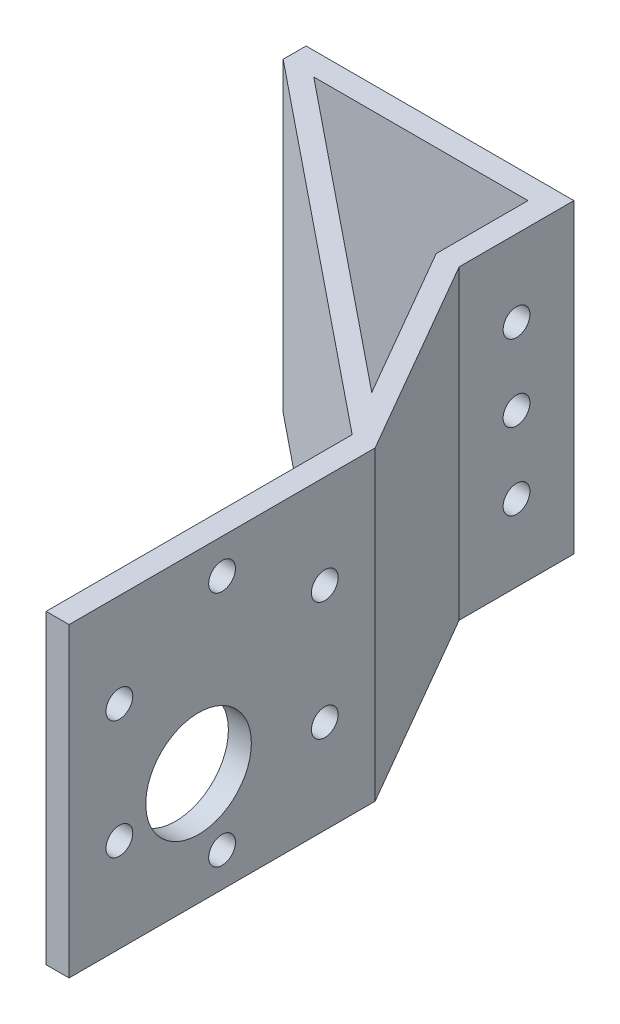
ISO-10303-21;
HEADER;
FILE_DESCRIPTION(('STEP AP214'),'2;1');
FILE_NAME('part.step','',(''),(''),'','','');
FILE_SCHEMA(('AUTOMOTIVE_DESIGN { 1 0 10303 214 1 1 1 1 }'));
ENDSEC;
DATA;
#1=APPLICATION_CONTEXT('core data for automotive mechanical design processes');
#2=APPLICATION_PROTOCOL_DEFINITION('international standard','automotive_design',2000,#1);
#3=PRODUCT_CONTEXT('',#1,'mechanical');
#4=PRODUCT('Part','Part','',(#3));
#5=PRODUCT_RELATED_PRODUCT_CATEGORY('part','',(#4));
#6=PRODUCT_DEFINITION_FORMATION('','',#4);
#7=PRODUCT_DEFINITION_CONTEXT('part definition',#1,'design');
#8=PRODUCT_DEFINITION('design','',#6,#7);
#9=PRODUCT_DEFINITION_SHAPE('','',#8);
#10=(LENGTH_UNIT() NAMED_UNIT(*) SI_UNIT(.MILLI.,.METRE.));
#11=(NAMED_UNIT(*) PLANE_ANGLE_UNIT() SI_UNIT($,.RADIAN.));
#12=(NAMED_UNIT(*) SI_UNIT($,.STERADIAN.) SOLID_ANGLE_UNIT());
#13=UNCERTAINTY_MEASURE_WITH_UNIT(LENGTH_MEASURE(1.E-05),#10,'distance_accuracy_value','');
#14=(GEOMETRIC_REPRESENTATION_CONTEXT(3) GLOBAL_UNCERTAINTY_ASSIGNED_CONTEXT((#13)) GLOBAL_UNIT_ASSIGNED_CONTEXT((#10,
#11,#12)) REPRESENTATION_CONTEXT('',''));
#15=CARTESIAN_POINT('',(0.,0.,0.));
#16=DIRECTION('',(0.,0.,1.));
#17=DIRECTION('',(1.,0.,0.));
#18=AXIS2_PLACEMENT_3D('',#15,#16,#17);
#19=CARTESIAN_POINT('',(0.,40.,0.));
#20=DIRECTION('',(0.,1.,0.));
#21=DIRECTION('',(0.,0.,1.));
#22=AXIS2_PLACEMENT_3D('',#19,#20,#21);
#23=PLANE('',#22);
#24=DIRECTION('',(0.,0.,-1.));
#25=VECTOR('',#24,1.);
#26=CARTESIAN_POINT('',(0.,40.,0.));
#27=LINE('',#26,#25);
#28=CARTESIAN_POINT('',(0.,40.,15.));
#29=VERTEX_POINT('',#28);
#30=CARTESIAN_POINT('',(0.,40.,0.));
#31=VERTEX_POINT('',#30);
#32=EDGE_CURVE('E164',#29,#31,#27,.T.);
#33=ORIENTED_EDGE('',*,*,#32,.T.);
#34=DIRECTION('',(-1.,0.,0.));
#35=VECTOR('',#34,1.);
#36=CARTESIAN_POINT('',(0.,40.,0.));
#37=LINE('',#36,#35);
#38=CARTESIAN_POINT('',(-35.,40.,0.));
#39=VERTEX_POINT('',#38);
#40=EDGE_CURVE('E167',#31,#39,#37,.T.);
#41=ORIENTED_EDGE('',*,*,#40,.T.);
#42=DIRECTION('',(-1.41090842712752E-13,0.,1.));
#43=VECTOR('',#42,1.);
#44=CARTESIAN_POINT('',(-35.,40.,0.));
#45=LINE('',#44,#43);
#46=CARTESIAN_POINT('',(-35.0000000000004,40.,3.0000000000006));
#47=VERTEX_POINT('',#46);
#48=EDGE_CURVE('E170',#39,#47,#45,.T.);
#49=ORIENTED_EDGE('',*,*,#48,.T.);
#50=DIRECTION('',(0.777785653858588,0.,0.628529614777035));
#51=VECTOR('',#50,1.);
#52=CARTESIAN_POINT('',(-35.0000000000004,40.,3.0000000000006));
#53=LINE('',#52,#51);
#54=CARTESIAN_POINT('',(12.0000000000003,40.,40.9807621135328));
#55=VERTEX_POINT('',#54);
#56=EDGE_CURVE('E172',#47,#55,#53,.T.);
#57=ORIENTED_EDGE('',*,*,#56,.T.);
#58=DIRECTION('',(0.,0.,1.));
#59=VECTOR('',#58,1.);
#60=CARTESIAN_POINT('',(12.0000000000003,40.,40.9807621135328));
#61=LINE('',#60,#59);
#62=CARTESIAN_POINT('',(12.,40.,80.9807621135331));
#63=VERTEX_POINT('',#62);
#64=EDGE_CURVE('E174',#55,#63,#61,.T.);
#65=ORIENTED_EDGE('',*,*,#64,.T.);
#66=DIRECTION('',(1.,0.,0.));
#67=VECTOR('',#66,1.);
#68=CARTESIAN_POINT('',(12.,40.,80.9807621135331));
#69=LINE('',#68,#67);
#70=CARTESIAN_POINT('',(15.,40.,80.9807621135331));
#71=VERTEX_POINT('',#70);
#72=EDGE_CURVE('E176',#63,#71,#69,.T.);
#73=ORIENTED_EDGE('',*,*,#72,.T.);
#74=DIRECTION('',(0.,0.,-1.));
#75=VECTOR('',#74,1.);
#76=CARTESIAN_POINT('',(15.,40.,40.9807621135331));
#77=LINE('',#76,#75);
#78=CARTESIAN_POINT('',(15.,40.,40.9807621135331));
#79=VERTEX_POINT('',#78);
#80=EDGE_CURVE('E178',#71,#79,#77,.T.);
#81=ORIENTED_EDGE('',*,*,#80,.T.);
#82=DIRECTION('',(-0.500000000000001,0.,-0.866025403784438));
#83=VECTOR('',#82,1.);
#84=CARTESIAN_POINT('',(0.,40.,15.));
#85=LINE('',#84,#83);
#86=EDGE_CURVE('E180',#79,#29,#85,.T.);
#87=ORIENTED_EDGE('',*,*,#86,.T.);
#88=EDGE_LOOP('',(#33,#41,#49,#57,#65,#73,#81,#87));
#89=FACE_BOUND('',#88,.T.);
#90=DIRECTION('',(0.777785653858585,0.,0.628529614777039));
#91=VECTOR('',#90,1.);
#92=CARTESIAN_POINT('',(-31.0000000000005,40.,3.00000000000068));
#93=LINE('',#92,#91);
#94=CARTESIAN_POINT('',(-31.0000000000005,40.,3.00000000000068));
#95=VERTEX_POINT('',#94);
#96=CARTESIAN_POINT('',(8.50153462367659,40.,34.9212423332204));
#97=VERTEX_POINT('',#96);
#98=EDGE_CURVE('E134',#95,#97,#93,.T.);
#99=ORIENTED_EDGE('',*,*,#98,.F.);
#100=DIRECTION('',(-1.,0.,0.));
#101=VECTOR('',#100,1.);
#102=CARTESIAN_POINT('',(-3.,40.,3.));
#103=LINE('',#102,#101);
#104=CARTESIAN_POINT('',(-3.,40.,3.));
#105=VERTEX_POINT('',#104);
#106=EDGE_CURVE('E126',#105,#95,#103,.T.);
#107=ORIENTED_EDGE('',*,*,#106,.F.);
#108=DIRECTION('',(0.,0.,-1.));
#109=VECTOR('',#108,1.);
#110=CARTESIAN_POINT('',(-2.99999999999996,40.,15.));
#111=LINE('',#110,#109);
#112=CARTESIAN_POINT('',(-2.99999999999996,40.,15.));
#113=VERTEX_POINT('',#112);
#114=EDGE_CURVE('E148',#113,#105,#111,.T.);
#115=ORIENTED_EDGE('',*,*,#114,.F.);
#116=DIRECTION('',(-0.500000000000001,0.,-0.866025403784438));
#117=VECTOR('',#116,1.);
#118=CARTESIAN_POINT('',(-2.99999999999996,40.,15.));
#119=LINE('',#118,#117);
#120=EDGE_CURVE('E146',#97,#113,#119,.T.);
#121=ORIENTED_EDGE('',*,*,#120,.F.);
#122=EDGE_LOOP('',(#99,#107,#115,#121));
#123=FACE_BOUND('',#122,.T.);
#124=ADVANCED_FACE('F37',(#89,#123),#23,.T.);
#125=CARTESIAN_POINT('',(0.,0.,0.));
#126=DIRECTION('',(0.,1.,0.));
#127=DIRECTION('',(0.,0.,1.));
#128=AXIS2_PLACEMENT_3D('',#125,#126,#127);
#129=PLANE('',#128);
#130=DIRECTION('',(0.,0.,-1.));
#131=VECTOR('',#130,1.);
#132=CARTESIAN_POINT('',(0.,0.,0.));
#133=LINE('',#132,#131);
#134=CARTESIAN_POINT('',(0.,0.,15.));
#135=VERTEX_POINT('',#134);
#136=CARTESIAN_POINT('',(0.,0.,0.));
#137=VERTEX_POINT('',#136);
#138=EDGE_CURVE('E142',#135,#137,#133,.T.);
#139=ORIENTED_EDGE('',*,*,#138,.F.);
#140=DIRECTION('',(-0.500000000000001,0.,-0.866025403784438));
#141=VECTOR('',#140,1.);
#142=CARTESIAN_POINT('',(0.,0.,15.));
#143=LINE('',#142,#141);
#144=CARTESIAN_POINT('',(15.,0.,40.9807621135331));
#145=VERTEX_POINT('',#144);
#146=EDGE_CURVE('E168',#145,#135,#143,.T.);
#147=ORIENTED_EDGE('',*,*,#146,.F.);
#148=DIRECTION('',(0.,0.,-1.));
#149=VECTOR('',#148,1.);
#150=CARTESIAN_POINT('',(15.,0.,40.9807621135331));
#151=LINE('',#150,#149);
#152=CARTESIAN_POINT('',(15.,0.,80.9807621135331));
#153=VERTEX_POINT('',#152);
#154=EDGE_CURVE('E195',#153,#145,#151,.T.);
#155=ORIENTED_EDGE('',*,*,#154,.F.);
#156=DIRECTION('',(1.,0.,0.));
#157=VECTOR('',#156,1.);
#158=CARTESIAN_POINT('',(12.,0.,80.9807621135331));
#159=LINE('',#158,#157);
#160=CARTESIAN_POINT('',(12.,0.,80.9807621135331));
#161=VERTEX_POINT('',#160);
#162=EDGE_CURVE('E193',#161,#153,#159,.T.);
#163=ORIENTED_EDGE('',*,*,#162,.F.);
#164=DIRECTION('',(0.,0.,1.));
#165=VECTOR('',#164,1.);
#166=CARTESIAN_POINT('',(12.0000000000003,0.,40.9807621135328));
#167=LINE('',#166,#165);
#168=CARTESIAN_POINT('',(12.0000000000003,0.,40.9807621135328));
#169=VERTEX_POINT('',#168);
#170=EDGE_CURVE('E191',#169,#161,#167,.T.);
#171=ORIENTED_EDGE('',*,*,#170,.F.);
#172=DIRECTION('',(0.777785653858588,0.,0.628529614777035));
#173=VECTOR('',#172,1.);
#174=CARTESIAN_POINT('',(-35.0000000000004,0.,3.0000000000006));
#175=LINE('',#174,#173);
#176=CARTESIAN_POINT('',(-35.0000000000004,0.,3.0000000000006));
#177=VERTEX_POINT('',#176);
#178=EDGE_CURVE('E189',#177,#169,#175,.T.);
#179=ORIENTED_EDGE('',*,*,#178,.F.);
#180=DIRECTION('',(-1.41090842712752E-13,0.,1.));
#181=VECTOR('',#180,1.);
#182=CARTESIAN_POINT('',(-35.,0.,0.));
#183=LINE('',#182,#181);
#184=CARTESIAN_POINT('',(-35.,0.,0.));
#185=VERTEX_POINT('',#184);
#186=EDGE_CURVE('E187',#185,#177,#183,.T.);
#187=ORIENTED_EDGE('',*,*,#186,.F.);
#188=DIRECTION('',(-1.,0.,0.));
#189=VECTOR('',#188,1.);
#190=CARTESIAN_POINT('',(0.,0.,0.));
#191=LINE('',#190,#189);
#192=EDGE_CURVE('E185',#137,#185,#191,.T.);
#193=ORIENTED_EDGE('',*,*,#192,.F.);
#194=EDGE_LOOP('',(#139,#147,#155,#163,#171,#179,#187,#193));
#195=FACE_BOUND('',#194,.T.);
#196=DIRECTION('',(-1.,0.,0.));
#197=VECTOR('',#196,1.);
#198=CARTESIAN_POINT('',(-3.,0.,3.));
#199=LINE('',#198,#197);
#200=CARTESIAN_POINT('',(-3.,0.,3.));
#201=VERTEX_POINT('',#200);
#202=CARTESIAN_POINT('',(-31.0000000000005,0.,3.00000000000068));
#203=VERTEX_POINT('',#202);
#204=EDGE_CURVE('E60',#201,#203,#199,.T.);
#205=ORIENTED_EDGE('',*,*,#204,.T.);
#206=DIRECTION('',(0.777785653858585,0.,0.628529614777039));
#207=VECTOR('',#206,1.);
#208=CARTESIAN_POINT('',(-31.0000000000005,0.,3.00000000000068));
#209=LINE('',#208,#207);
#210=CARTESIAN_POINT('',(8.50153462367659,0.,34.9212423332204));
#211=VERTEX_POINT('',#210);
#212=EDGE_CURVE('E141',#203,#211,#209,.T.);
#213=ORIENTED_EDGE('',*,*,#212,.T.);
#214=DIRECTION('',(-0.500000000000001,0.,-0.866025403784438));
#215=VECTOR('',#214,1.);
#216=CARTESIAN_POINT('',(-2.99999999999996,0.,15.));
#217=LINE('',#216,#215);
#218=CARTESIAN_POINT('',(-2.99999999999996,0.,15.));
#219=VERTEX_POINT('',#218);
#220=EDGE_CURVE('E156',#211,#219,#217,.T.);
#221=ORIENTED_EDGE('',*,*,#220,.T.);
#222=DIRECTION('',(0.,0.,-1.));
#223=VECTOR('',#222,1.);
#224=CARTESIAN_POINT('',(-2.99999999999996,0.,15.));
#225=LINE('',#224,#223);
#226=EDGE_CURVE('E135',#219,#201,#225,.T.);
#227=ORIENTED_EDGE('',*,*,#226,.T.);
#228=EDGE_LOOP('',(#205,#213,#221,#227));
#229=FACE_BOUND('',#228,.T.);
#230=ADVANCED_FACE('F225',(#195,#229),#129,.F.);
#231=CARTESIAN_POINT('',(0.,40.,0.));
#232=DIRECTION('',(-1.,0.,0.));
#233=DIRECTION('',(0.,0.,1.));
#234=AXIS2_PLACEMENT_3D('',#231,#232,#233);
#235=PLANE('',#234);
#236=CARTESIAN_POINT('',(0.,10.,7.5));
#237=DIRECTION('',(1.,0.,0.));
#238=DIRECTION('',(0.,0.,-1.));
#239=AXIS2_PLACEMENT_3D('',#236,#237,#238);
#240=CIRCLE('',#239,1.75);
#241=CARTESIAN_POINT('',(0.,10.,5.75));
#242=VERTEX_POINT('',#241);
#243=EDGE_CURVE('E341',#242,#242,#240,.T.);
#244=ORIENTED_EDGE('',*,*,#243,.F.);
#245=EDGE_LOOP('',(#244));
#246=FACE_BOUND('',#245,.T.);
#247=CARTESIAN_POINT('',(0.,30.,7.5));
#248=DIRECTION('',(1.,0.,0.));
#249=DIRECTION('',(0.,0.,-1.));
#250=AXIS2_PLACEMENT_3D('',#247,#248,#249);
#251=CIRCLE('',#250,1.75);
#252=CARTESIAN_POINT('',(0.,30.,5.75));
#253=VERTEX_POINT('',#252);
#254=EDGE_CURVE('E356',#253,#253,#251,.T.);
#255=ORIENTED_EDGE('',*,*,#254,.F.);
#256=EDGE_LOOP('',(#255));
#257=FACE_BOUND('',#256,.T.);
#258=CARTESIAN_POINT('',(0.,20.,7.5));
#259=DIRECTION('',(1.,0.,0.));
#260=DIRECTION('',(0.,0.,-1.));
#261=AXIS2_PLACEMENT_3D('',#258,#259,#260);
#262=CIRCLE('',#261,1.75);
#263=CARTESIAN_POINT('',(0.,20.,5.75));
#264=VERTEX_POINT('',#263);
#265=EDGE_CURVE('E355',#264,#264,#262,.T.);
#266=ORIENTED_EDGE('',*,*,#265,.F.);
#267=EDGE_LOOP('',(#266));
#268=FACE_BOUND('',#267,.T.);
#269=ORIENTED_EDGE('',*,*,#138,.T.);
#270=DIRECTION('',(0.,-1.,0.));
#271=VECTOR('',#270,1.);
#272=CARTESIAN_POINT('',(0.,40.,0.));
#273=LINE('',#272,#271);
#274=EDGE_CURVE('E11',#31,#137,#273,.T.);
#275=ORIENTED_EDGE('',*,*,#274,.F.);
#276=ORIENTED_EDGE('',*,*,#32,.F.);
#277=DIRECTION('',(0.,-1.,0.));
#278=VECTOR('',#277,1.);
#279=CARTESIAN_POINT('',(0.,40.,15.));
#280=LINE('',#279,#278);
#281=EDGE_CURVE('E182',#29,#135,#280,.T.);
#282=ORIENTED_EDGE('',*,*,#281,.T.);
#283=EDGE_LOOP('',(#269,#275,#276,#282));
#284=FACE_BOUND('',#283,.T.);
#285=ADVANCED_FACE('F39',(#246,#257,#268,#284),#235,.F.);
#286=CARTESIAN_POINT('',(0.,40.,0.));
#287=DIRECTION('',(0.,0.,1.));
#288=DIRECTION('',(1.,0.,0.));
#289=AXIS2_PLACEMENT_3D('',#286,#287,#288);
#290=PLANE('',#289);
#291=ORIENTED_EDGE('',*,*,#192,.T.);
#292=DIRECTION('',(0.,-1.,0.));
#293=VECTOR('',#292,1.);
#294=CARTESIAN_POINT('',(-35.,40.,0.));
#295=LINE('',#294,#293);
#296=EDGE_CURVE('E45',#39,#185,#295,.T.);
#297=ORIENTED_EDGE('',*,*,#296,.F.);
#298=ORIENTED_EDGE('',*,*,#40,.F.);
#299=ORIENTED_EDGE('',*,*,#274,.T.);
#300=EDGE_LOOP('',(#291,#297,#298,#299));
#301=FACE_BOUND('',#300,.T.);
#302=ADVANCED_FACE('F242',(#301),#290,.F.);
#303=CARTESIAN_POINT('',(-35.,40.,0.));
#304=DIRECTION('',(1.,0.,1.41090842712752E-13));
#305=DIRECTION('',(1.41090842712752E-13,0.,-1.));
#306=AXIS2_PLACEMENT_3D('',#303,#304,#305);
#307=PLANE('',#306);
#308=ORIENTED_EDGE('',*,*,#186,.T.);
#309=DIRECTION('',(0.,-1.,0.));
#310=VECTOR('',#309,1.);
#311=CARTESIAN_POINT('',(-35.0000000000004,40.,3.0000000000006));
#312=LINE('',#311,#310);
#313=EDGE_CURVE('E212',#47,#177,#312,.T.);
#314=ORIENTED_EDGE('',*,*,#313,.F.);
#315=ORIENTED_EDGE('',*,*,#48,.F.);
#316=ORIENTED_EDGE('',*,*,#296,.T.);
#317=EDGE_LOOP('',(#308,#314,#315,#316));
#318=FACE_BOUND('',#317,.T.);
#319=ADVANCED_FACE('F219',(#318),#307,.F.);
#320=CARTESIAN_POINT('',(-35.0000000000004,40.,3.0000000000006));
#321=DIRECTION('',(0.628529614777035,0.,-0.777785653858588));
#322=DIRECTION('',(-0.777785653858588,0.,-0.628529614777036));
#323=AXIS2_PLACEMENT_3D('',#320,#321,#322);
#324=PLANE('',#323);
#325=ORIENTED_EDGE('',*,*,#178,.T.);
#326=DIRECTION('',(0.,-1.,0.));
#327=VECTOR('',#326,1.);
#328=CARTESIAN_POINT('',(12.0000000000003,40.,40.9807621135328));
#329=LINE('',#328,#327);
#330=EDGE_CURVE('E209',#55,#169,#329,.T.);
#331=ORIENTED_EDGE('',*,*,#330,.F.);
#332=ORIENTED_EDGE('',*,*,#56,.F.);
#333=ORIENTED_EDGE('',*,*,#313,.T.);
#334=EDGE_LOOP('',(#325,#331,#332,#333));
#335=FACE_BOUND('',#334,.T.);
#336=ADVANCED_FACE('F231',(#335),#324,.F.);
#337=CARTESIAN_POINT('',(12.0000000000003,40.,40.9807621135328));
#338=DIRECTION('',(1.,0.,0.));
#339=DIRECTION('',(0.,0.,-1.));
#340=AXIS2_PLACEMENT_3D('',#337,#338,#339);
#341=PLANE('',#340);
#342=CARTESIAN_POINT('',(12.0000000000002,35.5000000000007,60.9807621135339));
#343=DIRECTION('',(1.,0.,0.));
#344=DIRECTION('',(0.,0.,-1.));
#345=AXIS2_PLACEMENT_3D('',#342,#343,#344);
#346=CIRCLE('',#345,1.75000000000054);
#347=CARTESIAN_POINT('',(12.0000000000002,35.5000000000007,59.2307621135334));
#348=VERTEX_POINT('',#347);
#349=EDGE_CURVE('E340',#348,#348,#346,.T.);
#350=ORIENTED_EDGE('',*,*,#349,.T.);
#351=EDGE_LOOP('',(#350));
#352=FACE_BOUND('',#351,.T.);
#353=CARTESIAN_POINT('',(12.0000000000002,4.50000000000326,60.9807621135335));
#354=DIRECTION('',(1.,0.,0.));
#355=DIRECTION('',(0.,0.,-1.));
#356=AXIS2_PLACEMENT_3D('',#353,#354,#355);
#357=CIRCLE('',#356,1.74999999999918);
#358=CARTESIAN_POINT('',(12.0000000000002,4.50000000000326,59.2307621135343));
#359=VERTEX_POINT('',#358);
#360=EDGE_CURVE('E342',#359,#359,#357,.T.);
#361=ORIENTED_EDGE('',*,*,#360,.T.);
#362=EDGE_LOOP('',(#361));
#363=FACE_BOUND('',#362,.T.);
#364=CARTESIAN_POINT('',(12.0000000000003,12.2500000000012,47.5573683548744));
#365=DIRECTION('',(1.,0.,0.));
#366=DIRECTION('',(0.,0.,-1.));
#367=AXIS2_PLACEMENT_3D('',#364,#365,#366);
#368=CIRCLE('',#367,1.74999999999969);
#369=CARTESIAN_POINT('',(12.0000000000003,12.2500000000012,45.8073683548747));
#370=VERTEX_POINT('',#369);
#371=EDGE_CURVE('E348',#370,#370,#368,.T.);
#372=ORIENTED_EDGE('',*,*,#371,.T.);
#373=EDGE_LOOP('',(#372));
#374=FACE_BOUND('',#373,.T.);
#375=CARTESIAN_POINT('',(12.0000000000003,27.7500000000053,47.5573683548774));
#376=DIRECTION('',(1.,0.,0.));
#377=DIRECTION('',(0.,0.,-1.));
#378=AXIS2_PLACEMENT_3D('',#375,#376,#377);
#379=CIRCLE('',#378,1.75000000000138);
#380=CARTESIAN_POINT('',(12.0000000000003,27.7500000000053,45.807368354876));
#381=VERTEX_POINT('',#380);
#382=EDGE_CURVE('E518',#381,#381,#379,.T.);
#383=ORIENTED_EDGE('',*,*,#382,.T.);
#384=EDGE_LOOP('',(#383));
#385=FACE_BOUND('',#384,.T.);
#386=CARTESIAN_POINT('',(12.0000000000002,14.6754314462416,64.0549032013668));
#387=DIRECTION('',(1.,0.,0.));
#388=DIRECTION('',(0.,0.,-1.));
#389=AXIS2_PLACEMENT_3D('',#386,#387,#388);
#390=CIRCLE('',#389,6.89828217566375);
#391=CARTESIAN_POINT('',(12.0000000000002,14.6754314462416,57.1566210257031));
#392=VERTEX_POINT('',#391);
#393=EDGE_CURVE('E521',#392,#392,#390,.T.);
#394=ORIENTED_EDGE('',*,*,#393,.T.);
#395=EDGE_LOOP('',(#394));
#396=FACE_BOUND('',#395,.T.);
#397=CARTESIAN_POINT('',(12.0000000000001,12.2500000000022,74.4041558721931));
#398=DIRECTION('',(1.,0.,0.));
#399=DIRECTION('',(0.,0.,-1.));
#400=AXIS2_PLACEMENT_3D('',#397,#398,#399);
#401=CIRCLE('',#400,1.7500000000004);
#402=CARTESIAN_POINT('',(12.0000000000001,12.2500000000022,72.6541558721927));
#403=VERTEX_POINT('',#402);
#404=EDGE_CURVE('E524',#403,#403,#401,.T.);
#405=ORIENTED_EDGE('',*,*,#404,.T.);
#406=EDGE_LOOP('',(#405));
#407=FACE_BOUND('',#406,.T.);
#408=CARTESIAN_POINT('',(12.0000000000001,27.7500000000016,74.4041558721918));
#409=DIRECTION('',(1.,0.,0.));
#410=DIRECTION('',(0.,0.,-1.));
#411=AXIS2_PLACEMENT_3D('',#408,#409,#410);
#412=CIRCLE('',#411,1.74999999999985);
#413=CARTESIAN_POINT('',(12.0000000000001,27.7500000000016,72.6541558721919));
#414=VERTEX_POINT('',#413);
#415=EDGE_CURVE('E527',#414,#414,#412,.T.);
#416=ORIENTED_EDGE('',*,*,#415,.T.);
#417=EDGE_LOOP('',(#416));
#418=FACE_BOUND('',#417,.T.);
#419=ORIENTED_EDGE('',*,*,#170,.T.);
#420=DIRECTION('',(0.,-1.,0.));
#421=VECTOR('',#420,1.);
#422=CARTESIAN_POINT('',(12.,40.,80.9807621135331));
#423=LINE('',#422,#421);
#424=EDGE_CURVE('E206',#63,#161,#423,.T.);
#425=ORIENTED_EDGE('',*,*,#424,.F.);
#426=ORIENTED_EDGE('',*,*,#64,.F.);
#427=ORIENTED_EDGE('',*,*,#330,.T.);
#428=EDGE_LOOP('',(#419,#425,#426,#427));
#429=FACE_BOUND('',#428,.T.);
#430=ADVANCED_FACE('F235',(#352,#363,#374,#385,#396,#407,#418,#429),#341,.F.);
#431=CARTESIAN_POINT('',(12.,40.,80.9807621135331));
#432=DIRECTION('',(0.,0.,-1.));
#433=DIRECTION('',(-1.,0.,0.));
#434=AXIS2_PLACEMENT_3D('',#431,#432,#433);
#435=PLANE('',#434);
#436=ORIENTED_EDGE('',*,*,#162,.T.);
#437=DIRECTION('',(0.,-1.,0.));
#438=VECTOR('',#437,1.);
#439=CARTESIAN_POINT('',(15.,40.,80.9807621135331));
#440=LINE('',#439,#438);
#441=EDGE_CURVE('E203',#71,#153,#440,.T.);
#442=ORIENTED_EDGE('',*,*,#441,.F.);
#443=ORIENTED_EDGE('',*,*,#72,.F.);
#444=ORIENTED_EDGE('',*,*,#424,.T.);
#445=EDGE_LOOP('',(#436,#442,#443,#444));
#446=FACE_BOUND('',#445,.T.);
#447=ADVANCED_FACE('F255',(#446),#435,.F.);
#448=CARTESIAN_POINT('',(15.,40.,40.9807621135331));
#449=DIRECTION('',(-1.,0.,0.));
#450=DIRECTION('',(0.,0.,1.));
#451=AXIS2_PLACEMENT_3D('',#448,#449,#450);
#452=PLANE('',#451);
#453=CARTESIAN_POINT('',(15.,35.5000000000007,60.9807621135339));
#454=DIRECTION('',(1.,0.,0.));
#455=DIRECTION('',(0.,0.,-1.));
#456=AXIS2_PLACEMENT_3D('',#453,#454,#455);
#457=CIRCLE('',#456,1.75000000000054);
#458=CARTESIAN_POINT('',(15.,35.5000000000007,59.2307621135334));
#459=VERTEX_POINT('',#458);
#460=EDGE_CURVE('E337',#459,#459,#457,.T.);
#461=ORIENTED_EDGE('',*,*,#460,.F.);
#462=EDGE_LOOP('',(#461));
#463=FACE_BOUND('',#462,.T.);
#464=CARTESIAN_POINT('',(15.,4.50000000000326,60.9807621135335));
#465=DIRECTION('',(1.,0.,0.));
#466=DIRECTION('',(0.,0.,-1.));
#467=AXIS2_PLACEMENT_3D('',#464,#465,#466);
#468=CIRCLE('',#467,1.74999999999918);
#469=CARTESIAN_POINT('',(15.,4.50000000000326,59.2307621135343));
#470=VERTEX_POINT('',#469);
#471=EDGE_CURVE('E536',#470,#470,#468,.T.);
#472=ORIENTED_EDGE('',*,*,#471,.F.);
#473=EDGE_LOOP('',(#472));
#474=FACE_BOUND('',#473,.T.);
#475=CARTESIAN_POINT('',(15.,12.2500000000012,47.5573683548744));
#476=DIRECTION('',(1.,0.,0.));
#477=DIRECTION('',(0.,0.,-1.));
#478=AXIS2_PLACEMENT_3D('',#475,#476,#477);
#479=CIRCLE('',#478,1.74999999999969);
#480=CARTESIAN_POINT('',(15.,12.2500000000012,45.8073683548747));
#481=VERTEX_POINT('',#480);
#482=EDGE_CURVE('E541',#481,#481,#479,.T.);
#483=ORIENTED_EDGE('',*,*,#482,.F.);
#484=EDGE_LOOP('',(#483));
#485=FACE_BOUND('',#484,.T.);
#486=CARTESIAN_POINT('',(15.,27.7500000000053,47.5573683548774));
#487=DIRECTION('',(1.,0.,0.));
#488=DIRECTION('',(0.,0.,-1.));
#489=AXIS2_PLACEMENT_3D('',#486,#487,#488);
#490=CIRCLE('',#489,1.75000000000138);
#491=CARTESIAN_POINT('',(15.,27.7500000000053,45.807368354876));
#492=VERTEX_POINT('',#491);
#493=EDGE_CURVE('E537',#492,#492,#490,.T.);
#494=ORIENTED_EDGE('',*,*,#493,.F.);
#495=EDGE_LOOP('',(#494));
#496=FACE_BOUND('',#495,.T.);
#497=CARTESIAN_POINT('',(15.,14.6754314462416,64.0549032013668));
#498=DIRECTION('',(1.,0.,0.));
#499=DIRECTION('',(0.,0.,-1.));
#500=AXIS2_PLACEMENT_3D('',#497,#498,#499);
#501=CIRCLE('',#500,6.89828217566375);
#502=CARTESIAN_POINT('',(15.,14.6754314462416,57.1566210257031));
#503=VERTEX_POINT('',#502);
#504=EDGE_CURVE('E540',#503,#503,#501,.T.);
#505=ORIENTED_EDGE('',*,*,#504,.F.);
#506=EDGE_LOOP('',(#505));
#507=FACE_BOUND('',#506,.T.);
#508=CARTESIAN_POINT('',(15.,12.2500000000022,74.4041558721931));
#509=DIRECTION('',(1.,0.,0.));
#510=DIRECTION('',(0.,0.,-1.));
#511=AXIS2_PLACEMENT_3D('',#508,#509,#510);
#512=CIRCLE('',#511,1.7500000000004);
#513=CARTESIAN_POINT('',(15.,12.2500000000022,72.6541558721927));
#514=VERTEX_POINT('',#513);
#515=EDGE_CURVE('E533',#514,#514,#512,.T.);
#516=ORIENTED_EDGE('',*,*,#515,.F.);
#517=EDGE_LOOP('',(#516));
#518=FACE_BOUND('',#517,.T.);
#519=CARTESIAN_POINT('',(15.,27.7500000000016,74.4041558721918));
#520=DIRECTION('',(1.,0.,0.));
#521=DIRECTION('',(0.,0.,-1.));
#522=AXIS2_PLACEMENT_3D('',#519,#520,#521);
#523=CIRCLE('',#522,1.74999999999985);
#524=CARTESIAN_POINT('',(15.,27.7500000000016,72.6541558721919));
#525=VERTEX_POINT('',#524);
#526=EDGE_CURVE('E530',#525,#525,#523,.T.);
#527=ORIENTED_EDGE('',*,*,#526,.F.);
#528=EDGE_LOOP('',(#527));
#529=FACE_BOUND('',#528,.T.);
#530=ORIENTED_EDGE('',*,*,#154,.T.);
#531=DIRECTION('',(0.,-1.,0.));
#532=VECTOR('',#531,1.);
#533=CARTESIAN_POINT('',(15.,40.,40.9807621135331));
#534=LINE('',#533,#532);
#535=EDGE_CURVE('E200',#79,#145,#534,.T.);
#536=ORIENTED_EDGE('',*,*,#535,.F.);
#537=ORIENTED_EDGE('',*,*,#80,.F.);
#538=ORIENTED_EDGE('',*,*,#441,.T.);
#539=EDGE_LOOP('',(#530,#536,#537,#538));
#540=FACE_BOUND('',#539,.T.);
#541=ADVANCED_FACE('F253',(#463,#474,#485,#496,#507,#518,#529,#540),#452,.F.);
#542=CARTESIAN_POINT('',(0.,40.,15.));
#543=DIRECTION('',(-0.866025403784438,0.,0.500000000000001));
#544=DIRECTION('',(0.500000000000001,0.,0.866025403784438));
#545=AXIS2_PLACEMENT_3D('',#542,#543,#544);
#546=PLANE('',#545);
#547=ORIENTED_EDGE('',*,*,#146,.T.);
#548=ORIENTED_EDGE('',*,*,#281,.F.);
#549=ORIENTED_EDGE('',*,*,#86,.F.);
#550=ORIENTED_EDGE('',*,*,#535,.T.);
#551=EDGE_LOOP('',(#547,#548,#549,#550));
#552=FACE_BOUND('',#551,.T.);
#553=ADVANCED_FACE('F248',(#552),#546,.F.);
#554=CARTESIAN_POINT('',(-3.,40.,3.));
#555=DIRECTION('',(0.,0.,1.));
#556=DIRECTION('',(1.,0.,0.));
#557=AXIS2_PLACEMENT_3D('',#554,#555,#556);
#558=PLANE('',#557);
#559=ORIENTED_EDGE('',*,*,#204,.F.);
#560=DIRECTION('',(0.,-1.,0.));
#561=VECTOR('',#560,1.);
#562=CARTESIAN_POINT('',(-3.,40.,3.));
#563=LINE('',#562,#561);
#564=EDGE_CURVE('E130',#105,#201,#563,.T.);
#565=ORIENTED_EDGE('',*,*,#564,.F.);
#566=ORIENTED_EDGE('',*,*,#106,.T.);
#567=DIRECTION('',(0.,-1.,0.));
#568=VECTOR('',#567,1.);
#569=CARTESIAN_POINT('',(-31.0000000000005,40.,3.00000000000068));
#570=LINE('',#569,#568);
#571=EDGE_CURVE('E129',#95,#203,#570,.T.);
#572=ORIENTED_EDGE('',*,*,#571,.T.);
#573=EDGE_LOOP('',(#559,#565,#566,#572));
#574=FACE_BOUND('',#573,.T.);
#575=ADVANCED_FACE('F128',(#574),#558,.T.);
#576=CARTESIAN_POINT('',(-31.0000000000005,40.,3.00000000000068));
#577=DIRECTION('',(0.628529614777039,0.,-0.777785653858585));
#578=DIRECTION('',(-0.777785653858585,0.,-0.628529614777039));
#579=AXIS2_PLACEMENT_3D('',#576,#577,#578);
#580=PLANE('',#579);
#581=ORIENTED_EDGE('',*,*,#212,.F.);
#582=ORIENTED_EDGE('',*,*,#571,.F.);
#583=ORIENTED_EDGE('',*,*,#98,.T.);
#584=DIRECTION('',(0.,-1.,0.));
#585=VECTOR('',#584,1.);
#586=CARTESIAN_POINT('',(8.50153462367659,40.,34.9212423332204));
#587=LINE('',#586,#585);
#588=EDGE_CURVE('E143',#97,#211,#587,.T.);
#589=ORIENTED_EDGE('',*,*,#588,.T.);
#590=EDGE_LOOP('',(#581,#582,#583,#589));
#591=FACE_BOUND('',#590,.T.);
#592=ADVANCED_FACE('F138',(#591),#580,.T.);
#593=CARTESIAN_POINT('',(-2.99999999999996,40.,15.));
#594=DIRECTION('',(-0.866025403784438,0.,0.500000000000001));
#595=DIRECTION('',(0.500000000000001,0.,0.866025403784438));
#596=AXIS2_PLACEMENT_3D('',#593,#594,#595);
#597=PLANE('',#596);
#598=ORIENTED_EDGE('',*,*,#220,.F.);
#599=ORIENTED_EDGE('',*,*,#588,.F.);
#600=ORIENTED_EDGE('',*,*,#120,.T.);
#601=DIRECTION('',(0.,-1.,0.));
#602=VECTOR('',#601,1.);
#603=CARTESIAN_POINT('',(-2.99999999999996,40.,15.));
#604=LINE('',#603,#602);
#605=EDGE_CURVE('E52',#113,#219,#604,.T.);
#606=ORIENTED_EDGE('',*,*,#605,.T.);
#607=EDGE_LOOP('',(#598,#599,#600,#606));
#608=FACE_BOUND('',#607,.T.);
#609=ADVANCED_FACE('F282',(#608),#597,.T.);
#610=CARTESIAN_POINT('',(-2.99999999999996,40.,15.));
#611=DIRECTION('',(-1.,0.,0.));
#612=DIRECTION('',(0.,0.,1.));
#613=AXIS2_PLACEMENT_3D('',#610,#611,#612);
#614=PLANE('',#613);
#615=CARTESIAN_POINT('',(-3.,10.,7.5));
#616=DIRECTION('',(1.,0.,0.));
#617=DIRECTION('',(0.,0.,-1.));
#618=AXIS2_PLACEMENT_3D('',#615,#616,#617);
#619=CIRCLE('',#618,1.75);
#620=CARTESIAN_POINT('',(-3.,10.,5.75));
#621=VERTEX_POINT('',#620);
#622=EDGE_CURVE('E345',#621,#621,#619,.T.);
#623=ORIENTED_EDGE('',*,*,#622,.T.);
#624=EDGE_LOOP('',(#623));
#625=FACE_BOUND('',#624,.T.);
#626=CARTESIAN_POINT('',(-3.,30.,7.5));
#627=DIRECTION('',(1.,0.,0.));
#628=DIRECTION('',(0.,0.,-1.));
#629=AXIS2_PLACEMENT_3D('',#626,#627,#628);
#630=CIRCLE('',#629,1.75);
#631=CARTESIAN_POINT('',(-3.,30.,5.75));
#632=VERTEX_POINT('',#631);
#633=EDGE_CURVE('E352',#632,#632,#630,.T.);
#634=ORIENTED_EDGE('',*,*,#633,.T.);
#635=EDGE_LOOP('',(#634));
#636=FACE_BOUND('',#635,.T.);
#637=CARTESIAN_POINT('',(-3.,20.,7.5));
#638=DIRECTION('',(1.,0.,0.));
#639=DIRECTION('',(0.,0.,-1.));
#640=AXIS2_PLACEMENT_3D('',#637,#638,#639);
#641=CIRCLE('',#640,1.75);
#642=CARTESIAN_POINT('',(-3.,20.,5.75));
#643=VERTEX_POINT('',#642);
#644=EDGE_CURVE('E154',#643,#643,#641,.T.);
#645=ORIENTED_EDGE('',*,*,#644,.T.);
#646=EDGE_LOOP('',(#645));
#647=FACE_BOUND('',#646,.T.);
#648=ORIENTED_EDGE('',*,*,#226,.F.);
#649=ORIENTED_EDGE('',*,*,#605,.F.);
#650=ORIENTED_EDGE('',*,*,#114,.T.);
#651=ORIENTED_EDGE('',*,*,#564,.T.);
#652=EDGE_LOOP('',(#648,#649,#650,#651));
#653=FACE_BOUND('',#652,.T.);
#654=ADVANCED_FACE('F286',(#625,#636,#647,#653),#614,.T.);
#655=CARTESIAN_POINT('',(-3.,20.,7.5));
#656=DIRECTION('',(1.,0.,0.));
#657=DIRECTION('',(0.,0.,-1.));
#658=AXIS2_PLACEMENT_3D('',#655,#656,#657);
#659=CYLINDRICAL_SURFACE('',#658,1.75);
#660=ORIENTED_EDGE('',*,*,#644,.F.);
#661=EDGE_LOOP('',(#660));
#662=FACE_BOUND('',#661,.T.);
#663=ORIENTED_EDGE('',*,*,#265,.T.);
#664=EDGE_LOOP('',(#663));
#665=FACE_BOUND('',#664,.T.);
#666=ADVANCED_FACE('F292',(#662,#665),#659,.F.);
#667=CARTESIAN_POINT('',(-3.,30.,7.5));
#668=DIRECTION('',(1.,0.,0.));
#669=DIRECTION('',(0.,0.,-1.));
#670=AXIS2_PLACEMENT_3D('',#667,#668,#669);
#671=CYLINDRICAL_SURFACE('',#670,1.75);
#672=ORIENTED_EDGE('',*,*,#633,.F.);
#673=EDGE_LOOP('',(#672));
#674=FACE_BOUND('',#673,.T.);
#675=ORIENTED_EDGE('',*,*,#254,.T.);
#676=EDGE_LOOP('',(#675));
#677=FACE_BOUND('',#676,.T.);
#678=ADVANCED_FACE('F296',(#674,#677),#671,.F.);
#679=CARTESIAN_POINT('',(-3.,10.,7.5));
#680=DIRECTION('',(1.,0.,0.));
#681=DIRECTION('',(0.,0.,-1.));
#682=AXIS2_PLACEMENT_3D('',#679,#680,#681);
#683=CYLINDRICAL_SURFACE('',#682,1.75);
#684=ORIENTED_EDGE('',*,*,#622,.F.);
#685=EDGE_LOOP('',(#684));
#686=FACE_BOUND('',#685,.T.);
#687=ORIENTED_EDGE('',*,*,#243,.T.);
#688=EDGE_LOOP('',(#687));
#689=FACE_BOUND('',#688,.T.);
#690=ADVANCED_FACE('F298',(#686,#689),#683,.F.);
#691=CARTESIAN_POINT('',(-21.9999999999999,27.7500000000016,74.4041558721918));
#692=DIRECTION('',(1.,0.,0.));
#693=DIRECTION('',(0.,0.,-1.));
#694=AXIS2_PLACEMENT_3D('',#691,#692,#693);
#695=CYLINDRICAL_SURFACE('',#694,1.74999999999985);
#696=ORIENTED_EDGE('',*,*,#526,.T.);
#697=EDGE_LOOP('',(#696));
#698=FACE_BOUND('',#697,.T.);
#699=ORIENTED_EDGE('',*,*,#415,.F.);
#700=EDGE_LOOP('',(#699));
#701=FACE_BOUND('',#700,.T.);
#702=ADVANCED_FACE('F301',(#698,#701),#695,.F.);
#703=CARTESIAN_POINT('',(-21.9999999999999,12.2500000000022,74.4041558721931));
#704=DIRECTION('',(1.,0.,0.));
#705=DIRECTION('',(0.,0.,-1.));
#706=AXIS2_PLACEMENT_3D('',#703,#704,#705);
#707=CYLINDRICAL_SURFACE('',#706,1.7500000000004);
#708=ORIENTED_EDGE('',*,*,#515,.T.);
#709=EDGE_LOOP('',(#708));
#710=FACE_BOUND('',#709,.T.);
#711=ORIENTED_EDGE('',*,*,#404,.F.);
#712=EDGE_LOOP('',(#711));
#713=FACE_BOUND('',#712,.T.);
#714=ADVANCED_FACE('F308',(#710,#713),#707,.F.);
#715=CARTESIAN_POINT('',(-22.,14.6754314462416,64.0549032013668));
#716=DIRECTION('',(1.,0.,0.));
#717=DIRECTION('',(0.,0.,-1.));
#718=AXIS2_PLACEMENT_3D('',#715,#716,#717);
#719=CYLINDRICAL_SURFACE('',#718,6.89828217566375);
#720=ORIENTED_EDGE('',*,*,#504,.T.);
#721=EDGE_LOOP('',(#720));
#722=FACE_BOUND('',#721,.T.);
#723=ORIENTED_EDGE('',*,*,#393,.F.);
#724=EDGE_LOOP('',(#723));
#725=FACE_BOUND('',#724,.T.);
#726=ADVANCED_FACE('F312',(#722,#725),#719,.F.);
#727=CARTESIAN_POINT('',(-22.,27.7500000000053,47.5573683548774));
#728=DIRECTION('',(1.,0.,0.));
#729=DIRECTION('',(0.,0.,-1.));
#730=AXIS2_PLACEMENT_3D('',#727,#728,#729);
#731=CYLINDRICAL_SURFACE('',#730,1.75000000000138);
#732=ORIENTED_EDGE('',*,*,#493,.T.);
#733=EDGE_LOOP('',(#732));
#734=FACE_BOUND('',#733,.T.);
#735=ORIENTED_EDGE('',*,*,#382,.F.);
#736=EDGE_LOOP('',(#735));
#737=FACE_BOUND('',#736,.T.);
#738=ADVANCED_FACE('F314',(#734,#737),#731,.F.);
#739=CARTESIAN_POINT('',(-22.,12.2500000000012,47.5573683548744));
#740=DIRECTION('',(1.,0.,0.));
#741=DIRECTION('',(0.,0.,-1.));
#742=AXIS2_PLACEMENT_3D('',#739,#740,#741);
#743=CYLINDRICAL_SURFACE('',#742,1.74999999999969);
#744=ORIENTED_EDGE('',*,*,#482,.T.);
#745=EDGE_LOOP('',(#744));
#746=FACE_BOUND('',#745,.T.);
#747=ORIENTED_EDGE('',*,*,#371,.F.);
#748=EDGE_LOOP('',(#747));
#749=FACE_BOUND('',#748,.T.);
#750=ADVANCED_FACE('F317',(#746,#749),#743,.F.);
#751=CARTESIAN_POINT('',(-22.,4.50000000000326,60.9807621135335));
#752=DIRECTION('',(1.,0.,0.));
#753=DIRECTION('',(0.,0.,-1.));
#754=AXIS2_PLACEMENT_3D('',#751,#752,#753);
#755=CYLINDRICAL_SURFACE('',#754,1.74999999999918);
#756=ORIENTED_EDGE('',*,*,#471,.T.);
#757=EDGE_LOOP('',(#756));
#758=FACE_BOUND('',#757,.T.);
#759=ORIENTED_EDGE('',*,*,#360,.F.);
#760=EDGE_LOOP('',(#759));
#761=FACE_BOUND('',#760,.T.);
#762=ADVANCED_FACE('F322',(#758,#761),#755,.F.);
#763=CARTESIAN_POINT('',(-22.,35.5000000000007,60.9807621135339));
#764=DIRECTION('',(1.,0.,0.));
#765=DIRECTION('',(0.,0.,-1.));
#766=AXIS2_PLACEMENT_3D('',#763,#764,#765);
#767=CYLINDRICAL_SURFACE('',#766,1.75000000000054);
#768=ORIENTED_EDGE('',*,*,#460,.T.);
#769=EDGE_LOOP('',(#768));
#770=FACE_BOUND('',#769,.T.);
#771=ORIENTED_EDGE('',*,*,#349,.F.);
#772=EDGE_LOOP('',(#771));
#773=FACE_BOUND('',#772,.T.);
#774=ADVANCED_FACE('F325',(#770,#773),#767,.F.);
#775=CLOSED_SHELL('',(#124,#230,#285,#302,#319,#336,#430,#447,#541,#553,#575,#592,#609,#654,
#666,#678,#690,#702,#714,#726,#738,#750,#762,#774));
#776=MANIFOLD_SOLID_BREP('B2',#775);
#777=ADVANCED_BREP_SHAPE_REPRESENTATION('',(#18,#776),#14);
#778=SHAPE_DEFINITION_REPRESENTATION(#9,#777);
ENDSEC;
END-ISO-10303-21;
